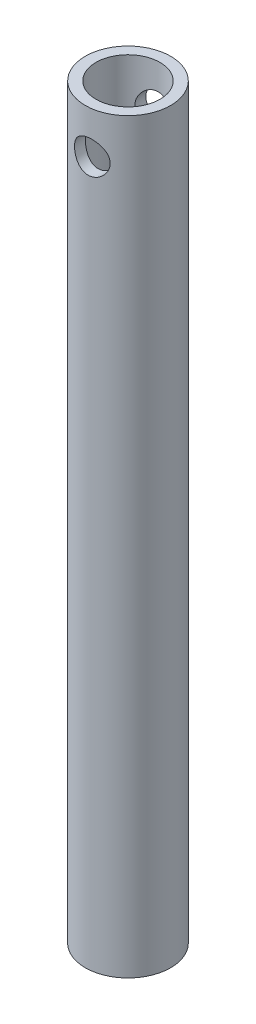
ISO-10303-21;
HEADER;
FILE_DESCRIPTION(('STEP AP214'),'2;1');
FILE_NAME('part.step','',(''),(''),'','','');
FILE_SCHEMA(('AUTOMOTIVE_DESIGN { 1 0 10303 214 1 1 1 1 }'));
ENDSEC;
DATA;
#1=APPLICATION_CONTEXT('core data for automotive mechanical design processes');
#2=APPLICATION_PROTOCOL_DEFINITION('international standard','automotive_design',2000,#1);
#3=PRODUCT_CONTEXT('',#1,'mechanical');
#4=PRODUCT('Part','Part','',(#3));
#5=PRODUCT_RELATED_PRODUCT_CATEGORY('part','',(#4));
#6=PRODUCT_DEFINITION_FORMATION('','',#4);
#7=PRODUCT_DEFINITION_CONTEXT('part definition',#1,'design');
#8=PRODUCT_DEFINITION('design','',#6,#7);
#9=PRODUCT_DEFINITION_SHAPE('','',#8);
#10=(LENGTH_UNIT() NAMED_UNIT(*) SI_UNIT(.MILLI.,.METRE.));
#11=(NAMED_UNIT(*) PLANE_ANGLE_UNIT() SI_UNIT($,.RADIAN.));
#12=(NAMED_UNIT(*) SI_UNIT($,.STERADIAN.) SOLID_ANGLE_UNIT());
#13=UNCERTAINTY_MEASURE_WITH_UNIT(LENGTH_MEASURE(1.E-05),#10,'distance_accuracy_value','');
#14=(GEOMETRIC_REPRESENTATION_CONTEXT(3) GLOBAL_UNCERTAINTY_ASSIGNED_CONTEXT((#13)) GLOBAL_UNIT_ASSIGNED_CONTEXT((#10,
#11,#12)) REPRESENTATION_CONTEXT('',''));
#15=CARTESIAN_POINT('',(0.,0.,0.));
#16=DIRECTION('',(0.,0.,1.));
#17=DIRECTION('',(1.,0.,0.));
#18=AXIS2_PLACEMENT_3D('',#15,#16,#17);
#19=CARTESIAN_POINT('',(0.,70.,0.));
#20=DIRECTION('',(0.,1.,0.));
#21=DIRECTION('',(0.,0.,1.));
#22=AXIS2_PLACEMENT_3D('',#19,#20,#21);
#23=PLANE('',#22);
#24=CARTESIAN_POINT('',(0.,70.,0.));
#25=DIRECTION('',(0.,1.,0.));
#26=DIRECTION('',(0.,0.,1.));
#27=AXIS2_PLACEMENT_3D('',#24,#25,#26);
#28=CIRCLE('',#27,4.);
#29=CARTESIAN_POINT('',(0.,70.,4.));
#30=VERTEX_POINT('',#29);
#31=EDGE_CURVE('E10',#30,#30,#28,.T.);
#32=ORIENTED_EDGE('',*,*,#31,.T.);
#33=EDGE_LOOP('',(#32));
#34=FACE_BOUND('',#33,.T.);
#35=CARTESIAN_POINT('',(0.,70.,0.));
#36=DIRECTION('',(0.,1.,0.));
#37=DIRECTION('',(0.,0.,1.));
#38=AXIS2_PLACEMENT_3D('',#35,#36,#37);
#39=CIRCLE('',#38,3.);
#40=CARTESIAN_POINT('',(0.,70.,3.));
#41=VERTEX_POINT('',#40);
#42=EDGE_CURVE('E52',#41,#41,#39,.T.);
#43=ORIENTED_EDGE('',*,*,#42,.F.);
#44=EDGE_LOOP('',(#43));
#45=FACE_BOUND('',#44,.T.);
#46=ADVANCED_FACE('F33',(#34,#45),#23,.T.);
#47=CARTESIAN_POINT('',(0.,0.,0.));
#48=DIRECTION('',(0.,1.,0.));
#49=DIRECTION('',(0.,0.,1.));
#50=AXIS2_PLACEMENT_3D('',#47,#48,#49);
#51=PLANE('',#50);
#52=CARTESIAN_POINT('',(0.,0.,0.));
#53=DIRECTION('',(0.,1.,0.));
#54=DIRECTION('',(0.,0.,1.));
#55=AXIS2_PLACEMENT_3D('',#52,#53,#54);
#56=CIRCLE('',#55,4.);
#57=CARTESIAN_POINT('',(0.,0.,4.));
#58=VERTEX_POINT('',#57);
#59=EDGE_CURVE('E47',#58,#58,#56,.T.);
#60=ORIENTED_EDGE('',*,*,#59,.F.);
#61=EDGE_LOOP('',(#60));
#62=FACE_BOUND('',#61,.T.);
#63=CARTESIAN_POINT('',(0.,0.,0.));
#64=DIRECTION('',(0.,1.,0.));
#65=DIRECTION('',(0.,0.,1.));
#66=AXIS2_PLACEMENT_3D('',#63,#64,#65);
#67=CIRCLE('',#66,3.);
#68=CARTESIAN_POINT('',(0.,0.,3.));
#69=VERTEX_POINT('',#68);
#70=EDGE_CURVE('E55',#69,#69,#67,.T.);
#71=ORIENTED_EDGE('',*,*,#70,.T.);
#72=EDGE_LOOP('',(#71));
#73=FACE_BOUND('',#72,.T.);
#74=ADVANCED_FACE('F91',(#62,#73),#51,.F.);
#75=CARTESIAN_POINT('',(0.,70.,0.));
#76=DIRECTION('',(0.,-1.,0.));
#77=DIRECTION('',(0.,0.,-1.));
#78=AXIS2_PLACEMENT_3D('',#75,#76,#77);
#79=CYLINDRICAL_SURFACE('',#78,4.);
#80=CARTESIAN_POINT('',(0.,67.4917269490292,-4.));
#81=CARTESIAN_POINT('',(-0.0788373065302599,67.5110436231205,-3.99999489766961));
#82=CARTESIAN_POINT('',(-0.159304397727403,67.5242228993834,-3.99764480396688));
#83=CARTESIAN_POINT('',(-0.321138622433209,67.5377168434366,-3.98791557728033));
#84=CARTESIAN_POINT('',(-0.402507347493832,67.5380031235299,-3.98052538332954));
#85=CARTESIAN_POINT('',(-0.563577946286623,67.5256601407071,-3.96092783542756));
#86=CARTESIAN_POINT('',(-0.643281695168394,67.5130463067094,-3.94872624675899));
#87=CARTESIAN_POINT('',(-0.798881367677585,67.4754187982033,-3.92021051086315));
#88=CARTESIAN_POINT('',(-0.874778622602919,67.4504094927106,-3.90389781366802));
#89=CARTESIAN_POINT('',(-1.02181563655633,67.388494114798,-3.86803444880794));
#90=CARTESIAN_POINT('',(-1.09288897796816,67.3514516416995,-3.84844797037252));
#91=CARTESIAN_POINT('',(-1.22778522763397,67.2666464427106,-3.80756086184323));
#92=CARTESIAN_POINT('',(-1.29160518123462,67.218879371583,-3.78625953920383));
#93=CARTESIAN_POINT('',(-1.41439973921752,67.1105855407826,-3.74219000203574));
#94=CARTESIAN_POINT('',(-1.47284215276615,67.0494586479695,-3.71941149327068));
#95=CARTESIAN_POINT('',(-1.57894922412302,66.9178902453849,-3.67562531511827));
#96=CARTESIAN_POINT('',(-1.62661092445421,66.8474461880109,-3.65461813264843));
#97=CARTESIAN_POINT('',(-1.71105480887936,66.6969511285998,-3.61586941574365));
#98=CARTESIAN_POINT('',(-1.74752858747836,66.6167009621338,-3.59822481063042));
#99=CARTESIAN_POINT('',(-1.80670908221566,66.4502628789054,-3.56888022557227));
#100=CARTESIAN_POINT('',(-1.82942378887753,66.3640784408987,-3.55717679595529));
#101=CARTESIAN_POINT('',(-1.85932329825666,66.1934158654087,-3.54163617587586));
#102=CARTESIAN_POINT('',(-1.86731220433447,66.1091159332998,-3.53739231972852));
#103=CARTESIAN_POINT('',(-1.86990776457482,65.9402642355827,-3.53602177124517));
#104=CARTESIAN_POINT('',(-1.86451815986788,65.8557125469792,-3.53889308924073));
#105=CARTESIAN_POINT('',(-1.84121822101411,65.6933620566073,-3.55106596707563));
#106=CARTESIAN_POINT('',(-1.82397133018087,65.6154403904415,-3.56002652612055));
#107=CARTESIAN_POINT('',(-1.77825339467914,65.4637690292592,-3.58308043357723));
#108=CARTESIAN_POINT('',(-1.74978002401317,65.3900202024303,-3.59717484561815));
#109=CARTESIAN_POINT('',(-1.68114457767746,65.2457130823766,-3.62977180304372));
#110=CARTESIAN_POINT('',(-1.64058547078237,65.1753769998278,-3.64841939302795));
#111=CARTESIAN_POINT('',(-1.54921419957654,65.0424692067343,-3.68814506592021));
#112=CARTESIAN_POINT('',(-1.49839813425539,64.9799004649949,-3.70922407225335));
#113=CARTESIAN_POINT('',(-1.38377655294891,64.8599128414243,-3.75355585515979));
#114=CARTESIAN_POINT('',(-1.31932562025489,64.8031270078755,-3.77685930250062));
#115=CARTESIAN_POINT('',(-1.18128324487396,64.7013978789229,-3.82228244530812));
#116=CARTESIAN_POINT('',(-1.10769155609761,64.6564549024569,-3.84440210888174));
#117=CARTESIAN_POINT('',(-0.953168357028421,64.5798779423249,-3.8855950736423));
#118=CARTESIAN_POINT('',(-0.87224452886944,64.5482302203792,-3.90467150675653));
#119=CARTESIAN_POINT('',(-0.705250060488064,64.4994242395428,-3.938255933801));
#120=CARTESIAN_POINT('',(-0.619181990735531,64.4822588079085,-3.95276618701911));
#121=CARTESIAN_POINT('',(-0.449926800596583,64.4637412132407,-3.97547662337077));
#122=CARTESIAN_POINT('',(-0.366880991422428,64.4614941243278,-3.98400580363309));
#123=CARTESIAN_POINT('',(-0.201162574425986,64.4705312879024,-3.9958016193708));
#124=CARTESIAN_POINT('',(-0.118489916404065,64.481813662314,-3.99906898511105));
#125=CARTESIAN_POINT('',(0.0417597967812074,64.5169479592993,-4.00056332055015));
#126=CARTESIAN_POINT('',(0.119414547330616,64.5404435296705,-3.9989272249973));
#127=CARTESIAN_POINT('',(0.270034191638674,64.5989686649615,-3.99158775730873));
#128=CARTESIAN_POINT('',(0.342998236168557,64.6340003114405,-3.98588365092807));
#129=CARTESIAN_POINT('',(0.485460951388437,64.7162701190235,-3.97110474560388));
#130=CARTESIAN_POINT('',(0.554684907354761,64.7639596022612,-3.96189830091026));
#131=CARTESIAN_POINT('',(0.684581235656084,64.8695098709859,-3.94153256378582));
#132=CARTESIAN_POINT('',(0.74525007168168,64.9273748404921,-3.93037246804922));
#133=CARTESIAN_POINT('',(0.859745307545728,65.0555148540223,-3.90697405761038));
#134=CARTESIAN_POINT('',(0.912989886555816,65.126307012427,-3.89471047021926));
#135=CARTESIAN_POINT('',(1.00670051714888,65.2761170406162,-3.87154916698182));
#136=CARTESIAN_POINT('',(1.04716761510629,65.3551342361305,-3.86065133933469));
#137=CARTESIAN_POINT('',(1.11340479301031,65.518350157364,-3.84207070082473));
#138=CARTESIAN_POINT('',(1.13934925651437,65.6024733348214,-3.83435005152196));
#139=CARTESIAN_POINT('',(1.17609754107573,65.7742242720537,-3.82324135262324));
#140=CARTESIAN_POINT('',(1.18691099636713,65.8618497652339,-3.81985054624477));
#141=CARTESIAN_POINT('',(1.19265320633912,66.0314509259938,-3.81805984390158));
#142=CARTESIAN_POINT('',(1.18864979633725,66.11338858611,-3.81932440467651));
#143=CARTESIAN_POINT('',(1.16730111770524,66.2753336674558,-3.8259025566676));
#144=CARTESIAN_POINT('',(1.14995542151063,66.3553410267426,-3.83121627764236));
#145=CARTESIAN_POINT('',(1.103015288488,66.5100557087019,-3.84498873278364));
#146=CARTESIAN_POINT('',(1.07360590932742,66.5848239417985,-3.85339976281352));
#147=CARTESIAN_POINT('',(1.00358449274703,66.7286282859668,-3.87222513337279));
#148=CARTESIAN_POINT('',(0.962970417641847,66.7976633514311,-3.882639838186));
#149=CARTESIAN_POINT('',(0.868747887377558,66.9328083471191,-3.90483834687131));
#150=CARTESIAN_POINT('',(0.814472754939432,66.9984461964489,-3.91666712055755));
#151=CARTESIAN_POINT('',(0.695913771344472,67.1202468917107,-3.93945994951222));
#152=CARTESIAN_POINT('',(0.631620616448353,67.1764008278787,-3.95042318655127));
#153=CARTESIAN_POINT('',(0.491416730554627,67.2801822949264,-3.97035944599307));
#154=CARTESIAN_POINT('',(0.415104360289099,67.3272908552549,-3.9792159830811));
#155=CARTESIAN_POINT('',(0.255458933599028,67.4079653802893,-3.99263105308191));
#156=CARTESIAN_POINT('',(0.17214815044299,67.4415724777002,-3.99720269769333));
#157=CARTESIAN_POINT('',(0.0580152197047034,67.4766203414226,-3.99968386192807));
#158=CARTESIAN_POINT('',(0.029118778669897,67.4845922816711,-4.00000188455994));
#159=CARTESIAN_POINT('',(0.,67.4917269490292,-4.));
#160=B_SPLINE_CURVE_WITH_KNOTS('',3,(#80,#81,#82,#83,#84,#85,#86,#87,#88,#89,#90,#91,#92,#93,
#94,#95,#96,#97,#98,#99,#100,#101,#102,#103,#104,#105,#106,#107,#108,#109,#110,#111,#112,#113,
#114,#115,#116,#117,#118,#119,#120,#121,#122,#123,#124,#125,#126,#127,#128,#129,#130,#131,#132,
#133,#134,#135,#136,#137,#138,#139,#140,#141,#142,#143,#144,#145,#146,#147,#148,#149,#150,#151,
#152,#153,#154,#155,#156,#157,#158,#159),.UNSPECIFIED.,.T.,.F.,(4,2,2,2,2,2,2,2,2,2,2,2,2,2,2,2,
2,2,2,2,2,2,2,2,2,2,2,2,2,2,2,2,2,2,2,2,2,2,2,4),(0.,0.243423716208972,0.487383374689661,
0.731051591042171,0.974633982986962,1.2210799006927,1.46762585055477,1.72919451642182,
1.99083485172477,2.25914673664873,2.52730265079862,2.78032482379793,3.03327625033319,
3.27311690373754,3.51300727550088,3.76186204591452,4.01081164175784,4.27657181449168,
4.54233914363048,4.80783116998601,5.0731916269581,5.32247743413712,5.57172864101648,
5.81408467857504,6.05648447062466,6.30907668283815,6.56177300138085,6.82877529846122,
7.09575572449507,7.35945750328431,7.62299130103259,7.86791459058808,8.11284572923791,
8.35415233027978,8.59550284428733,8.85234293288997,9.10942298643676,9.37847733555282,
9.64670566893686,9.73661489627166),.UNSPECIFIED.);
#161=CARTESIAN_POINT('',(0.,67.4917269490292,-4.));
#162=VERTEX_POINT('',#161);
#163=EDGE_CURVE('E80',#162,#162,#160,.T.);
#164=ORIENTED_EDGE('',*,*,#163,.T.);
#165=EDGE_LOOP('',(#164));
#166=FACE_BOUND('',#165,.T.);
#167=CARTESIAN_POINT('',(1.86879998793855,66.,3.53660665116731));
#168=CARTESIAN_POINT('',(1.8688035107803,65.9172016319896,3.53660259074607));
#169=CARTESIAN_POINT('',(1.86237080686964,65.8344280639135,3.54002580359437));
#170=CARTESIAN_POINT('',(1.83691086393603,65.6713861902512,3.55330311484212));
#171=CARTESIAN_POINT('',(1.81788446600017,65.5911177177336,3.56315678377414));
#172=CARTESIAN_POINT('',(1.7679812938652,65.4354898942085,3.58817643478059));
#173=CARTESIAN_POINT('',(1.73713416945002,65.360118807957,3.60332911715832));
#174=CARTESIAN_POINT('',(1.66447792197011,65.2158031913658,3.63746056203964));
#175=CARTESIAN_POINT('',(1.62266534186397,65.1468606970544,3.65644053072172));
#176=CARTESIAN_POINT('',(1.52681513899232,65.0137609709022,3.69752288876452));
#177=CARTESIAN_POINT('',(1.47229141643743,64.9499862471459,3.71973072955965));
#178=CARTESIAN_POINT('',(1.35342989575371,64.8325174228374,3.76460618593175));
#179=CARTESIAN_POINT('',(1.28908987608,64.7788256103196,3.78727390457518));
#180=CARTESIAN_POINT('',(1.14944349849035,64.6811785826497,3.83201484528164));
#181=CARTESIAN_POINT('',(1.0738261142031,64.6376426603364,3.85403742052194));
#182=CARTESIAN_POINT('',(0.91534722481457,64.5643564237125,3.89471663669162));
#183=CARTESIAN_POINT('',(0.832488378109677,64.5346010755071,3.91337450518889));
#184=CARTESIAN_POINT('',(0.665761196837425,64.4910727394619,3.94507722201446));
#185=CARTESIAN_POINT('',(0.582106303967788,64.4766404456327,3.95833697883411));
#186=CARTESIAN_POINT('',(0.412909954256455,64.4620516370825,3.97954325787178));
#187=CARTESIAN_POINT('',(0.32736915088858,64.4618902528572,3.98749159152905));
#188=CARTESIAN_POINT('',(0.161561879982912,64.4754719299924,3.99755473816795));
#189=CARTESIAN_POINT('',(0.0812519235832048,64.488494419364,3.99995067248709));
#190=CARTESIAN_POINT('',(-0.0763619107084567,64.5268572538322,4.00004783306756));
#191=CARTESIAN_POINT('',(-0.153665574270889,64.5521984754435,3.99774872522528));
#192=CARTESIAN_POINT('',(-0.304371830499327,64.6147954008967,3.98912820648107));
#193=CARTESIAN_POINT('',(-0.377699928429818,64.6522215748641,3.98274788011144));
#194=CARTESIAN_POINT('',(-0.517474620194825,64.7377721530324,3.96701076608413));
#195=CARTESIAN_POINT('',(-0.583918927216506,64.7859000957889,3.95765299348745));
#196=CARTESIAN_POINT('',(-0.712250532034038,64.8949209137261,3.93664620600407));
#197=CARTESIAN_POINT('',(-0.773611577533238,64.9564139288115,3.92489215171034));
#198=CARTESIAN_POINT('',(-0.885346504528378,65.0886844612624,3.90120892654826));
#199=CARTESIAN_POINT('',(-0.935717341931394,65.1594645423092,3.88927970813661));
#200=CARTESIAN_POINT('',(-1.0250320451953,65.3105048179041,3.8667156129137));
#201=CARTESIAN_POINT('',(-1.06366888841747,65.3909534117071,3.85611917917063));
#202=CARTESIAN_POINT('',(-1.12628546854526,65.5577087919174,3.8383008722836));
#203=CARTESIAN_POINT('',(-1.15027384320089,65.6440120925583,3.8310770110306));
#204=CARTESIAN_POINT('',(-1.18154008217207,65.8147338251632,3.82154636299028));
#205=CARTESIAN_POINT('',(-1.18969729228423,65.89897656036,3.81898137178796));
#206=CARTESIAN_POINT('',(-1.19158905054509,66.0676281491762,3.81839221813498));
#207=CARTESIAN_POINT('',(-1.18532746330284,66.1520369522266,3.82036683895115));
#208=CARTESIAN_POINT('',(-1.15938105544922,66.3141291974238,3.82831562887016));
#209=CARTESIAN_POINT('',(-1.14039372499833,66.3919365339286,3.83408169511909));
#210=CARTESIAN_POINT('',(-1.09047830161702,66.543322100856,3.84857474691943));
#211=CARTESIAN_POINT('',(-1.05954769023302,66.6168994355453,3.85730235691801));
#212=CARTESIAN_POINT('',(-0.98536737441305,66.7609013081634,3.8769283109629));
#213=CARTESIAN_POINT('',(-0.941687830513189,66.8310941579383,3.88789750302242));
#214=CARTESIAN_POINT('',(-0.843821722916746,66.9636550137087,3.91030457386383));
#215=CARTESIAN_POINT('',(-0.789631154248021,67.0260200221279,3.92174262998073));
#216=CARTESIAN_POINT('',(-0.668107796382752,67.1454973303814,3.9443245130749));
#217=CARTESIAN_POINT('',(-0.600137305120231,67.2019767350438,3.95539714604808));
#218=CARTESIAN_POINT('',(-0.45547306129637,67.3030303555612,3.97465245998321));
#219=CARTESIAN_POINT('',(-0.378779173173766,67.3476043863711,3.98283509602661));
#220=CARTESIAN_POINT('',(-0.218906791252603,67.4233296144611,3.99480688413877));
#221=CARTESIAN_POINT('',(-0.135744440631196,67.4545130364234,3.99860662133168));
#222=CARTESIAN_POINT('',(0.03471409176319,67.5023789055994,4.00075540859501));
#223=CARTESIAN_POINT('',(0.122008200744318,67.5190685443251,3.99910716379357));
#224=CARTESIAN_POINT('',(0.292497798275983,67.5366695855864,3.99014890996347));
#225=CARTESIAN_POINT('',(0.375619814467115,67.5384785535635,3.98318920540434));
#226=CARTESIAN_POINT('',(0.540459005941292,67.528597591592,3.9641876949098));
#227=CARTESIAN_POINT('',(0.622176363532491,67.5169094270445,3.95214655374802));
#228=CARTESIAN_POINT('',(0.779711070323915,67.4810010775886,3.9240654658449));
#229=CARTESIAN_POINT('',(0.855627507243296,67.457122238875,3.90814030995172));
#230=CARTESIAN_POINT('',(1.0020516903021,67.397856754727,3.87318528417108));
#231=CARTESIAN_POINT('',(1.07255840911673,67.3624679301572,3.85415482671068));
#232=CARTESIAN_POINT('',(1.20955382218379,67.2794648480246,3.81343756256585));
#233=CARTESIAN_POINT('',(1.27574024657142,67.2313911258195,3.79167180858893));
#234=CARTESIAN_POINT('',(1.39928965585652,67.1250952068552,3.74783845579778));
#235=CARTESIAN_POINT('',(1.45664941987506,67.0668693219905,3.72577074998373));
#236=CARTESIAN_POINT('',(1.56434272851,66.9380513014662,3.68190208885253));
#237=CARTESIAN_POINT('',(1.6141031166588,66.8669493356049,3.66018523679437));
#238=CARTESIAN_POINT('',(1.70127425863515,66.7165580844404,3.62049281326484));
#239=CARTESIAN_POINT('',(1.7386825356072,66.6372671612602,3.60251799241535));
#240=CARTESIAN_POINT('',(1.80196218441064,66.4671788058275,3.57131235061347));
#241=CARTESIAN_POINT('',(1.82692672508794,66.3759685367068,3.55846535073308));
#242=CARTESIAN_POINT('',(1.86033736378348,66.1898260731686,3.54111798298392));
#243=CARTESIAN_POINT('',(1.86879595034415,66.0948967481387,3.53661130489155));
#244=CARTESIAN_POINT('',(1.86879998793855,66.,3.53660665116731));
#245=B_SPLINE_CURVE_WITH_KNOTS('',3,(#167,#168,#169,#170,#171,#172,#173,#174,#175,#176,#177,
#178,#179,#180,#181,#182,#183,#184,#185,#186,#187,#188,#189,#190,#191,#192,#193,#194,#195,#196,
#197,#198,#199,#200,#201,#202,#203,#204,#205,#206,#207,#208,#209,#210,#211,#212,#213,#214,#215,
#216,#217,#218,#219,#220,#221,#222,#223,#224,#225,#226,#227,#228,#229,#230,#231,#232,#233,#234,
#235,#236,#237,#238,#239,#240,#241,#242,#243,#244),.UNSPECIFIED.,.T.,.F.,(4,2,2,2,2,2,2,2,2,2,2,
2,2,2,2,2,2,2,2,2,2,2,2,2,2,2,2,2,2,2,2,2,2,2,2,2,2,2,4),(0.,0.248041299853615,
0.496066035601143,0.74347268350972,0.990957424422035,1.25019019163778,1.50948171357769,
1.77809230051371,2.04660468936035,2.30302686863549,2.55936155147739,2.80240416701657,
3.04546407829833,3.29211445213626,3.53884650287771,3.80064937527497,4.06252467063179,
4.33075605619045,4.59882912085601,4.85153018609314,5.10416352882001,5.34397332222248,
5.58383371143261,5.83296256325329,6.082186526742,6.34812693324286,6.6140714730125,
6.87937237729171,7.14454156947849,7.39358954967929,7.64260495853364,7.88500177546199,
8.12744451106095,8.38029129894764,8.63323013382462,8.90032993191567,9.16748325659872,
9.45198333819375,9.73626808106746),.UNSPECIFIED.);
#246=CARTESIAN_POINT('',(1.86879998793855,66.,3.53660665116731));
#247=VERTEX_POINT('',#246);
#248=EDGE_CURVE('E75',#247,#247,#245,.T.);
#249=ORIENTED_EDGE('',*,*,#248,.T.);
#250=EDGE_LOOP('',(#249));
#251=FACE_BOUND('',#250,.T.);
#252=ORIENTED_EDGE('',*,*,#31,.F.);
#253=EDGE_LOOP('',(#252));
#254=FACE_BOUND('',#253,.T.);
#255=ORIENTED_EDGE('',*,*,#59,.T.);
#256=EDGE_LOOP('',(#255));
#257=FACE_BOUND('',#256,.T.);
#258=ADVANCED_FACE('F35',(#166,#251,#254,#257),#79,.T.);
#259=CARTESIAN_POINT('',(0.,70.,0.));
#260=DIRECTION('',(0.,-1.,0.));
#261=DIRECTION('',(0.,0.,-1.));
#262=AXIS2_PLACEMENT_3D('',#259,#260,#261);
#263=CYLINDRICAL_SURFACE('',#262,3.);
#264=CARTESIAN_POINT('',(0.,67.5113694608738,-3.));
#265=CARTESIAN_POINT('',(-0.0768984226662803,67.5253179840861,-2.99999618335784));
#266=CARTESIAN_POINT('',(-0.154909421757543,67.5334857608982,-2.99701603459122));
#267=CARTESIAN_POINT('',(-0.310833254203282,67.5378387873436,-2.98488030168071));
#268=CARTESIAN_POINT('',(-0.388745938094846,67.5340133507333,-2.97571921587844));
#269=CARTESIAN_POINT('',(-0.542035238058692,67.5145661924311,-2.95164498884355));
#270=CARTESIAN_POINT('',(-0.617415618358228,67.4989628697387,-2.93674083698539));
#271=CARTESIAN_POINT('',(-0.763802117551297,67.4566664814394,-2.90211500708126));
#272=CARTESIAN_POINT('',(-0.834807821419187,67.4299723655033,-2.88239287283175));
#273=CARTESIAN_POINT('',(-0.972821330202758,67.3655980169041,-2.8388378366801));
#274=CARTESIAN_POINT('',(-1.03966653687645,67.3276371103571,-2.81490720333529));
#275=CARTESIAN_POINT('',(-1.16605667704619,67.2421539310256,-2.76494809143101));
#276=CARTESIAN_POINT('',(-1.22559834575552,67.1946274071598,-2.73891868324312));
#277=CARTESIAN_POINT('',(-1.34234368370512,67.08564622302,-2.68378490258162));
#278=CARTESIAN_POINT('',(-1.39865888309758,67.0232567228134,-2.65464247699602));
#279=CARTESIAN_POINT('',(-1.50048007892911,66.8892981045309,-2.59845121035426));
#280=CARTESIAN_POINT('',(-1.54597866284217,66.8177227428975,-2.57140381351058));
#281=CARTESIAN_POINT('',(-1.62674922658111,66.6635913157279,-2.5211202996215));
#282=CARTESIAN_POINT('',(-1.66152340627914,66.5807046193206,-2.49808678714558));
#283=CARTESIAN_POINT('',(-1.71682331184553,66.4085468647892,-2.46041836904136));
#284=CARTESIAN_POINT('',(-1.73737058053183,66.3192856862131,-2.44577077105806));
#285=CARTESIAN_POINT('',(-1.7617028177924,66.1474558852262,-2.42829204939466));
#286=CARTESIAN_POINT('',(-1.767079316492,66.0652272385661,-2.4243409476111));
#287=CARTESIAN_POINT('',(-1.76537472528497,65.9009792492068,-2.42558363336256));
#288=CARTESIAN_POINT('',(-1.75829723314533,65.818959852913,-2.43077477984263));
#289=CARTESIAN_POINT('',(-1.73327871654925,65.6652136429858,-2.44866190528664));
#290=CARTESIAN_POINT('',(-1.71637750105221,65.5932266208602,-2.4606370890126));
#291=CARTESIAN_POINT('',(-1.67324093700475,65.4533244436362,-2.49016959698857));
#292=CARTESIAN_POINT('',(-1.64700259393589,65.3854106030262,-2.50772871187369));
#293=CARTESIAN_POINT('',(-1.583361017914,65.2494251295059,-2.54843179600546));
#294=CARTESIAN_POINT('',(-1.54521323840246,65.1818060045814,-2.57191780068665));
#295=CARTESIAN_POINT('',(-1.45959738198615,65.0537741128094,-2.62145423845995));
#296=CARTESIAN_POINT('',(-1.41212345170736,64.9933659102319,-2.64750627692573));
#297=CARTESIAN_POINT('',(-1.30211481601376,64.8737063518536,-2.70347131805123));
#298=CARTESIAN_POINT('',(-1.23844182789826,64.8155307598624,-2.73346194299788));
#299=CARTESIAN_POINT('',(-1.10126853977247,64.7109527297808,-2.79154985765827));
#300=CARTESIAN_POINT('',(-1.02776752600666,64.6645511474818,-2.81964700963635));
#301=CARTESIAN_POINT('',(-0.872774888946482,64.5853267163774,-2.87139320813509));
#302=CARTESIAN_POINT('',(-0.79132283829655,64.5524404776983,-2.89506272942707));
#303=CARTESIAN_POINT('',(-0.622404779362813,64.5015276549679,-2.93600700737172));
#304=CARTESIAN_POINT('',(-0.534944639437658,64.4834867882548,-2.95328790165362));
#305=CARTESIAN_POINT('',(-0.366297769699554,64.4643222272306,-2.97864655501644));
#306=CARTESIAN_POINT('',(-0.2854014790123,64.4616377035357,-2.98749306950824));
#307=CARTESIAN_POINT('',(-0.123762783039378,64.4691384040669,-2.99853939023353));
#308=CARTESIAN_POINT('',(-0.0430203507879492,64.4793211151971,-3.00074049409572));
#309=CARTESIAN_POINT('',(0.11201797466838,64.511259729482,-2.99886386216026));
#310=CARTESIAN_POINT('',(0.186437824429028,64.5324421258936,-2.99507979478743));
#311=CARTESIAN_POINT('',(0.331049267333571,64.585173329929,-2.98256247553521));
#312=CARTESIAN_POINT('',(0.401240071219111,64.6167240655275,-2.97382830297337));
#313=CARTESIAN_POINT('',(0.540247893887428,64.6915175876276,-2.95184630596701));
#314=CARTESIAN_POINT('',(0.60869150979712,64.7353779371669,-2.93834604668761));
#315=CARTESIAN_POINT('',(0.737852791801128,64.8325561300063,-2.90860345314593));
#316=CARTESIAN_POINT('',(0.798565437947182,64.8858800650516,-2.89235935298991));
#317=CARTESIAN_POINT('',(0.916872252233282,65.0068180400992,-2.85718924340808));
#318=CARTESIAN_POINT('',(0.973516652223904,65.0753348949739,-2.83815868403767));
#319=CARTESIAN_POINT('',(1.07452970153033,65.2212796909131,-2.8014783731373));
#320=CARTESIAN_POINT('',(1.11889525568943,65.2987098718283,-2.78382897056139));
#321=CARTESIAN_POINT('',(1.19377409672401,65.4611926269616,-2.75255618229575));
#322=CARTESIAN_POINT('',(1.22423597128515,65.5462721209894,-2.7389478030466));
#323=CARTESIAN_POINT('',(1.26924502998375,65.7212648609536,-2.71839151377972));
#324=CARTESIAN_POINT('',(1.28381797818089,65.8111700328322,-2.71143282349303));
#325=CARTESIAN_POINT('',(1.29523240037462,65.980637847212,-2.70599301522138));
#326=CARTESIAN_POINT('',(1.29412166769433,66.0600358533935,-2.70653268310198));
#327=CARTESIAN_POINT('',(1.27914542646839,66.2173432005476,-2.71364226442381));
#328=CARTESIAN_POINT('',(1.26527843923721,66.2952523678676,-2.72021287696272));
#329=CARTESIAN_POINT('',(1.2265822193216,66.4434881192631,-2.73786671524435));
#330=CARTESIAN_POINT('',(1.20233581747246,66.5139990587191,-2.74870786240565));
#331=CARTESIAN_POINT('',(1.14403507679465,66.6502390505273,-2.77347862708964));
#332=CARTESIAN_POINT('',(1.10997810158775,66.7159668115491,-2.78740907456272));
#333=CARTESIAN_POINT('',(1.02870051714205,66.8487308666851,-2.81848731550299));
#334=CARTESIAN_POINT('',(0.980428915302543,66.9150797594289,-2.83582076947233));
#335=CARTESIAN_POINT('',(0.874153227288174,67.039587300072,-2.87036228858231));
#336=CARTESIAN_POINT('',(0.816139244654329,67.0977375079996,-2.88757020746641));
#337=CARTESIAN_POINT('',(0.6850903983551,67.2102812424023,-2.92159096380113));
#338=CARTESIAN_POINT('',(0.61112229022271,67.2636628042634,-2.93817851753852));
#339=CARTESIAN_POINT('',(0.454595757543085,67.3573886795617,-2.96641674365597));
#340=CARTESIAN_POINT('',(0.372055870686365,67.3977603830944,-2.97807780427237));
#341=CARTESIAN_POINT('',(0.240210352247511,67.4486401612032,-2.99073053521713));
#342=CARTESIAN_POINT('',(0.193085369500583,67.464342346936,-2.99416264051249));
#343=CARTESIAN_POINT('',(0.0974572694575231,67.4912672485026,-2.99879864549884));
#344=CARTESIAN_POINT('',(0.0489540808646481,67.5024897321407,-3.00000242970145));
#345=CARTESIAN_POINT('',(0.,67.5113694608738,-3.));
#346=B_SPLINE_CURVE_WITH_KNOTS('',3,(#264,#265,#266,#267,#268,#269,#270,#271,#272,#273,#274,
#275,#276,#277,#278,#279,#280,#281,#282,#283,#284,#285,#286,#287,#288,#289,#290,#291,#292,#293,
#294,#295,#296,#297,#298,#299,#300,#301,#302,#303,#304,#305,#306,#307,#308,#309,#310,#311,#312,
#313,#314,#315,#316,#317,#318,#319,#320,#321,#322,#323,#324,#325,#326,#327,#328,#329,#330,#331,
#332,#333,#334,#335,#336,#337,#338,#339,#340,#341,#342,#343,#344,#345),.UNSPECIFIED.,.T.,.F.,(4,
2,2,2,2,2,2,2,2,2,2,2,2,2,2,2,2,2,2,2,2,2,2,2,2,2,2,2,2,2,2,2,2,2,2,2,2,2,2,2,4),(0.,
0.234275196400792,0.468759196979596,0.702877651028668,0.937018281807326,1.17756687170983,
1.4182226014386,1.68392801770318,1.94981499790219,2.22664192546651,2.50304875118934,
2.7491343462319,2.99514886259025,3.2189255459576,3.44277406171797,3.68515656361956,
3.92769168095205,4.20035338501299,4.47303490176145,4.74442247173962,5.01554863473795,
5.2585482209821,5.50150035438207,5.73289665936877,5.96433601646434,6.21054227829662,
6.45690760267197,6.7284026513116,6.99996607412659,7.2725256929759,7.54464269323981,
7.78159929655971,8.01858337098859,8.24371726116357,8.46891170770475,8.71948633025139,
8.97031704731655,9.24711237265289,9.52332108534,9.67245460671986,9.82159585710619),.UNSPECIFIED.);
#347=CARTESIAN_POINT('',(0.,67.5113694608738,-3.));
#348=VERTEX_POINT('',#347);
#349=EDGE_CURVE('E38',#348,#348,#346,.T.);
#350=ORIENTED_EDGE('',*,*,#349,.F.);
#351=EDGE_LOOP('',(#350));
#352=FACE_BOUND('',#351,.T.);
#353=CARTESIAN_POINT('',(1.76631446654935,66.,2.42489859690224));
#354=CARTESIAN_POINT('',(1.76630936531196,65.9202542111842,2.42490654831135));
#355=CARTESIAN_POINT('',(1.76043472275445,65.8404146720779,2.42921532326839));
#356=CARTESIAN_POINT('',(1.73721375148341,65.68321083729,2.44586981408112));
#357=CARTESIAN_POINT('',(1.71984449215747,65.6058518140747,2.45823159410617));
#358=CARTESIAN_POINT('',(1.67450532465514,65.4561830358476,2.48933239526335));
#359=CARTESIAN_POINT('',(1.64659395221406,65.383847964118,2.50803614461411));
#360=CARTESIAN_POINT('',(1.58102182424525,65.2451750030118,2.54987809155989));
#361=CARTESIAN_POINT('',(1.54336014295397,65.1788376839117,2.57301671017867));
#362=CARTESIAN_POINT('',(1.45538416197361,65.0476939237612,2.62386212917543));
#363=CARTESIAN_POINT('',(1.40425565514268,64.9835195500307,2.65179108981386));
#364=CARTESIAN_POINT('',(1.2922284961079,64.8645551952233,2.70815044204045));
#365=CARTESIAN_POINT('',(1.23132479335174,64.8097700957258,2.73658108603805));
#366=CARTESIAN_POINT('',(1.09597473544122,64.707296526217,2.79367220515642));
#367=CARTESIAN_POINT('',(1.02087114279227,64.6603964457263,2.82220353599573));
#368=CARTESIAN_POINT('',(0.862105824814752,64.5805740462369,2.87467260493745));
#369=CARTESIAN_POINT('',(0.778449805618221,64.5476424820819,2.89861337556458));
#370=CARTESIAN_POINT('',(0.611409438178499,64.4992316632848,2.93819522856433));
#371=CARTESIAN_POINT('',(0.528463464864363,64.4826408782335,2.95431953671271));
#372=CARTESIAN_POINT('',(0.359935394921756,64.4637109580217,2.9795449281482));
#373=CARTESIAN_POINT('',(0.274355019082843,64.4613627101785,2.98865049891832));
#374=CARTESIAN_POINT('',(0.111367628402722,64.470580997874,2.99894298405535));
#375=CARTESIAN_POINT('',(0.0339263355308848,64.480899265931,3.00077577435417));
#376=CARTESIAN_POINT('',(-0.118471655103097,64.512908406866,2.99862853687115));
#377=CARTESIAN_POINT('',(-0.193428165636509,64.5346001346743,2.99464807207321));
#378=CARTESIAN_POINT('',(-0.339933910330274,64.5888519337969,2.98159874293247));
#379=CARTESIAN_POINT('',(-0.411424790929855,64.6215522932316,2.97246311214962));
#380=CARTESIAN_POINT('',(-0.548419690567736,64.6966839118984,2.95026417994969));
#381=CARTESIAN_POINT('',(-0.613921594611031,64.7391185903643,2.93719949792876));
#382=CARTESIAN_POINT('',(-0.74383009992084,64.8372755135134,2.90716093172342));
#383=CARTESIAN_POINT('',(-0.807502135210138,64.8938917345223,2.88992959870851));
#384=CARTESIAN_POINT('',(-0.924937291622706,65.0164265564348,2.85451586212419));
#385=CARTESIAN_POINT('',(-0.978692141669914,65.0823528418979,2.83633268077771));
#386=CARTESIAN_POINT('',(-1.07825558326873,65.2271824339108,2.80006499511966));
#387=CARTESIAN_POINT('',(-1.12326002399782,65.306667262737,2.7820738581324));
#388=CARTESIAN_POINT('',(-1.19849640904673,65.4731460829528,2.75050664543577));
#389=CARTESIAN_POINT('',(-1.22874433473232,65.5601318300905,2.73692579871943));
#390=CARTESIAN_POINT('',(-1.27092091711801,65.7318275536853,2.71758389432168));
#391=CARTESIAN_POINT('',(-1.28412529969571,65.8161596171737,2.71128259123142));
#392=CARTESIAN_POINT('',(-1.29562467550299,65.9860384926972,2.70580980695117));
#393=CARTESIAN_POINT('',(-1.29393145753859,66.0715842907626,2.70663268822578));
#394=CARTESIAN_POINT('',(-1.27687094803832,66.2307270393212,2.71471223191118));
#395=CARTESIAN_POINT('',(-1.26313325624656,66.304547191297,2.72120179060808));
#396=CARTESIAN_POINT('',(-1.22489505542391,66.4487889347432,2.73862559877853));
#397=CARTESIAN_POINT('',(-1.20039083005111,66.5192093433822,2.74956138288207));
#398=CARTESIAN_POINT('',(-1.1402452567596,66.6583460240156,2.77505844761815));
#399=CARTESIAN_POINT('',(-1.10414443734472,66.7268358025669,2.78976307040339));
#400=CARTESIAN_POINT('',(-1.02236248024822,66.8574389980007,2.82075992917804));
#401=CARTESIAN_POINT('',(-0.976676407595327,66.9195491056751,2.83705298064836));
#402=CARTESIAN_POINT('',(-0.870050977553073,67.0443094854173,2.87168118352051));
#403=CARTESIAN_POINT('',(-0.807889541777036,67.1059249617879,2.88999858135023));
#404=CARTESIAN_POINT('',(-0.67393412476339,67.2185225179571,2.92413924172507));
#405=CARTESIAN_POINT('',(-0.602136387885534,67.2695004319948,2.93996152657221));
#406=CARTESIAN_POINT('',(-0.448088238300865,67.3607733812278,2.96740959227765));
#407=CARTESIAN_POINT('',(-0.365579992064111,67.4006817549265,2.97888764507715));
#408=CARTESIAN_POINT('',(-0.194356407365006,67.4658801395205,2.994927825474));
#409=CARTESIAN_POINT('',(-0.105646860168982,67.4911835904773,2.99949631783287));
#410=CARTESIAN_POINT('',(0.0663471733445806,67.5241766651632,3.00038091261131));
#411=CARTESIAN_POINT('',(0.149352233128206,67.5333047121439,2.99743600056775));
#412=CARTESIAN_POINT('',(0.315190404968872,67.5379861526934,2.98455364714909));
#413=CARTESIAN_POINT('',(0.398023571098651,67.5335447933181,2.97461890976265));
#414=CARTESIAN_POINT('',(0.554977886290851,67.512137707926,2.9492160445013));
#415=CARTESIAN_POINT('',(0.629299340212991,67.4960865432672,2.93419242195828));
#416=CARTESIAN_POINT('',(0.773595990766828,67.4531884766516,2.89949292192756));
#417=CARTESIAN_POINT('',(0.843570590586018,67.4263400960286,2.87981640738386));
#418=CARTESIAN_POINT('',(0.980511460605658,67.3614800378997,2.83619036278003));
#419=CARTESIAN_POINT('',(1.04723470907799,67.3230536992689,2.81209809330731));
#420=CARTESIAN_POINT('',(1.17331408521653,67.2366426309498,2.76187383523715));
#421=CARTESIAN_POINT('',(1.2326668537466,67.1886535687612,2.73574092537999));
#422=CARTESIAN_POINT('',(1.34892325540873,67.078728423375,2.68047845439215));
#423=CARTESIAN_POINT('',(1.40493552501989,67.0158623300997,2.651319022437));
#424=CARTESIAN_POINT('',(1.50609184729802,66.8809435831813,2.59519597822521));
#425=CARTESIAN_POINT('',(1.55122545687708,66.8088822030884,2.56823449220791));
#426=CARTESIAN_POINT('',(1.63108151655066,66.6539507636045,2.51830912093992));
#427=CARTESIAN_POINT('',(1.66532574416453,66.570767458925,2.49554370073811));
#428=CARTESIAN_POINT('',(1.71946278425624,66.3982042048849,2.45856635344939));
#429=CARTESIAN_POINT('',(1.73940336429683,66.308845983503,2.44432598325046));
#430=CARTESIAN_POINT('',(1.75653920383565,66.182031786234,2.43199424798801));
#431=CARTESIAN_POINT('',(1.76019906225084,66.1457811132817,2.42934316011081));
#432=CARTESIAN_POINT('',(1.76508794160716,66.0730268595556,2.42579345616141));
#433=CARTESIAN_POINT('',(1.76631680289632,66.0365232623295,2.42489495518768));
#434=CARTESIAN_POINT('',(1.76631446654935,66.,2.42489859690224));
#435=B_SPLINE_CURVE_WITH_KNOTS('',3,(#353,#354,#355,#356,#357,#358,#359,#360,#361,#362,#363,
#364,#365,#366,#367,#368,#369,#370,#371,#372,#373,#374,#375,#376,#377,#378,#379,#380,#381,#382,
#383,#384,#385,#386,#387,#388,#389,#390,#391,#392,#393,#394,#395,#396,#397,#398,#399,#400,#401,
#402,#403,#404,#405,#406,#407,#408,#409,#410,#411,#412,#413,#414,#415,#416,#417,#418,#419,#420,
#421,#422,#423,#424,#425,#426,#427,#428,#429,#430,#431,#432,#433,#434),.UNSPECIFIED.,.T.,.F.,(4,
2,2,2,2,2,2,2,2,2,2,2,2,2,2,2,2,2,2,2,2,2,2,2,2,2,2,2,2,2,2,2,2,2,2,2,2,2,2,2,4),(0.,
0.239083474741845,0.478645340698936,0.716896126521301,0.955169541866182,1.21411387046856,
1.47319242113183,1.75081079481139,2.02824513711058,2.28514067472785,2.54187182768274,
2.77521250132677,3.00857071744514,3.24502298896213,3.48155844318059,3.74124287936409,
4.0011429265887,4.27897492924357,4.55650536703009,4.81175567845689,5.06680402275487,
5.29189290256911,5.51705953862684,5.75255887394114,5.98817975502271,6.25525552110605,
6.52243568088278,6.79802370729463,7.07335772005699,7.32267518509795,7.57189625557106,
7.80336689009967,8.03486923506191,8.27591741253817,8.5170750489464,8.78322646267484,
9.04963236276645,9.32649571246954,9.60243010684218,9.71192222153871,9.82142152672196),.UNSPECIFIED.);
#436=CARTESIAN_POINT('',(1.76631446654935,66.,2.42489859690224));
#437=VERTEX_POINT('',#436);
#438=EDGE_CURVE('E57',#437,#437,#435,.T.);
#439=ORIENTED_EDGE('',*,*,#438,.F.);
#440=EDGE_LOOP('',(#439));
#441=FACE_BOUND('',#440,.T.);
#442=ORIENTED_EDGE('',*,*,#42,.T.);
#443=EDGE_LOOP('',(#442));
#444=FACE_BOUND('',#443,.T.);
#445=ORIENTED_EDGE('',*,*,#70,.F.);
#446=EDGE_LOOP('',(#445));
#447=FACE_BOUND('',#446,.T.);
#448=ADVANCED_FACE('F62',(#352,#441,#444,#447),#263,.F.);
#449=CARTESIAN_POINT('',(-0.399349978674941,66.,-4.33193471375852));
#450=DIRECTION('',(0.0917981923272467,0.,0.995777631745888));
#451=DIRECTION('',(0.995777631745888,0.,-0.0917981923272467));
#452=AXIS2_PLACEMENT_3D('',#449,#450,#451);
#453=CYLINDRICAL_SURFACE('',#452,1.53625512864654);
#454=ORIENTED_EDGE('',*,*,#438,.T.);
#455=EDGE_LOOP('',(#454));
#456=FACE_BOUND('',#455,.T.);
#457=ORIENTED_EDGE('',*,*,#248,.F.);
#458=EDGE_LOOP('',(#457));
#459=FACE_BOUND('',#458,.T.);
#460=ADVANCED_FACE('F68',(#456,#459),#453,.F.);
#461=ORIENTED_EDGE('',*,*,#349,.T.);
#462=EDGE_LOOP('',(#461));
#463=FACE_BOUND('',#462,.T.);
#464=ORIENTED_EDGE('',*,*,#163,.F.);
#465=EDGE_LOOP('',(#464));
#466=FACE_BOUND('',#465,.T.);
#467=ADVANCED_FACE('F65',(#463,#466),#453,.F.);
#468=CLOSED_SHELL('',(#46,#74,#258,#448,#460,#467));
#469=MANIFOLD_SOLID_BREP('B2',#468);
#470=ADVANCED_BREP_SHAPE_REPRESENTATION('',(#18,#469),#14);
#471=SHAPE_DEFINITION_REPRESENTATION(#9,#470);
ENDSEC;
END-ISO-10303-21;
